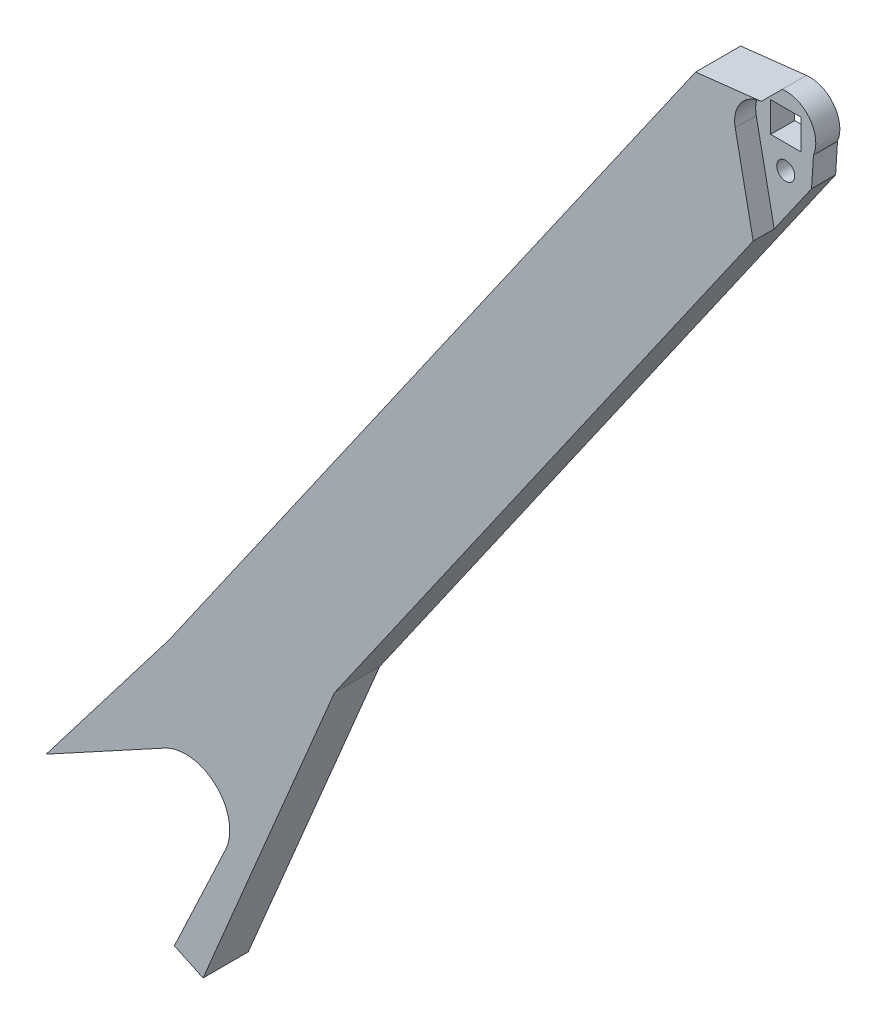
ISO-10303-21;
HEADER;
FILE_DESCRIPTION(('STEP AP214'),'2;1');
FILE_NAME('part.step','',(''),(''),'','','');
FILE_SCHEMA(('AUTOMOTIVE_DESIGN { 1 0 10303 214 1 1 1 1 }'));
ENDSEC;
DATA;
#1=APPLICATION_CONTEXT('core data for automotive mechanical design processes');
#2=APPLICATION_PROTOCOL_DEFINITION('international standard','automotive_design',2000,#1);
#3=PRODUCT_CONTEXT('',#1,'mechanical');
#4=PRODUCT('Part','Part','',(#3));
#5=PRODUCT_RELATED_PRODUCT_CATEGORY('part','',(#4));
#6=PRODUCT_DEFINITION_FORMATION('','',#4);
#7=PRODUCT_DEFINITION_CONTEXT('part definition',#1,'design');
#8=PRODUCT_DEFINITION('design','',#6,#7);
#9=PRODUCT_DEFINITION_SHAPE('','',#8);
#10=(LENGTH_UNIT() NAMED_UNIT(*) SI_UNIT(.MILLI.,.METRE.));
#11=(NAMED_UNIT(*) PLANE_ANGLE_UNIT() SI_UNIT($,.RADIAN.));
#12=(NAMED_UNIT(*) SI_UNIT($,.STERADIAN.) SOLID_ANGLE_UNIT());
#13=UNCERTAINTY_MEASURE_WITH_UNIT(LENGTH_MEASURE(1.E-05),#10,'distance_accuracy_value','');
#14=(GEOMETRIC_REPRESENTATION_CONTEXT(3) GLOBAL_UNCERTAINTY_ASSIGNED_CONTEXT((#13)) GLOBAL_UNIT_ASSIGNED_CONTEXT((#10,
#11,#12)) REPRESENTATION_CONTEXT('',''));
#15=CARTESIAN_POINT('',(0.,0.,0.));
#16=DIRECTION('',(0.,0.,1.));
#17=DIRECTION('',(1.,0.,0.));
#18=AXIS2_PLACEMENT_3D('',#15,#16,#17);
#19=CARTESIAN_POINT('',(157.605048009033,186.145582035712,9.525));
#20=DIRECTION('',(-0.998013276199365,0.0630039723335802,0.));
#21=DIRECTION('',(-0.0630039723335802,-0.998013276199365,0.));
#22=AXIS2_PLACEMENT_3D('',#19,#20,#21);
#23=PLANE('',#22);
#24=DIRECTION('',(0.0630039723335805,0.998013276199365,0.));
#25=VECTOR('',#24,1.);
#26=CARTESIAN_POINT('',(157.605048009033,186.145582035712,5.08));
#27=LINE('',#26,#25);
#28=CARTESIAN_POINT('',(157.204972784715,179.808197731846,5.08));
#29=VERTEX_POINT('',#28);
#30=CARTESIAN_POINT('',(157.605048009033,186.145582035712,5.08));
#31=VERTEX_POINT('',#30);
#32=EDGE_CURVE('E223',#29,#31,#27,.T.);
#33=ORIENTED_EDGE('',*,*,#32,.F.);
#34=DIRECTION('',(0.,0.,-1.));
#35=VECTOR('',#34,1.);
#36=CARTESIAN_POINT('',(157.204972784715,179.808197731846,9.525));
#37=LINE('',#36,#35);
#38=CARTESIAN_POINT('',(157.204972784715,179.808197731846,0.));
#39=VERTEX_POINT('',#38);
#40=EDGE_CURVE('E315',#29,#39,#37,.T.);
#41=ORIENTED_EDGE('',*,*,#40,.T.);
#42=DIRECTION('',(0.0630039723335802,0.998013276199365,0.));
#43=VECTOR('',#42,1.);
#44=CARTESIAN_POINT('',(157.605048009033,186.145582035712,0.));
#45=LINE('',#44,#43);
#46=CARTESIAN_POINT('',(157.605048009033,186.145582035712,0.));
#47=VERTEX_POINT('',#46);
#48=EDGE_CURVE('E269',#39,#47,#45,.T.);
#49=ORIENTED_EDGE('',*,*,#48,.T.);
#50=DIRECTION('',(0.,0.,-1.));
#51=VECTOR('',#50,1.);
#52=CARTESIAN_POINT('',(157.605048009033,186.145582035712,9.525));
#53=LINE('',#52,#51);
#54=EDGE_CURVE('E313',#31,#47,#53,.T.);
#55=ORIENTED_EDGE('',*,*,#54,.F.);
#56=EDGE_LOOP('',(#33,#41,#49,#55));
#57=FACE_BOUND('',#56,.T.);
#58=ADVANCED_FACE('F45',(#57),#23,.F.);
#59=CARTESIAN_POINT('',(151.750836383494,188.605400371159,9.525));
#60=DIRECTION('',(0.,0.,-1.));
#61=DIRECTION('',(-1.,0.,0.));
#62=AXIS2_PLACEMENT_3D('',#59,#60,#61);
#63=CYLINDRICAL_SURFACE('',#62,6.35);
#64=CARTESIAN_POINT('',(151.750836383494,188.605400371159,5.08));
#65=DIRECTION('',(0.,0.,1.));
#66=DIRECTION('',(1.,0.,0.));
#67=AXIS2_PLACEMENT_3D('',#64,#65,#66);
#68=CIRCLE('',#67,6.35);
#69=CARTESIAN_POINT('',(151.038083588784,194.915272275852,5.08));
#70=VERTEX_POINT('',#69);
#71=EDGE_CURVE('E214',#31,#70,#68,.T.);
#72=ORIENTED_EDGE('',*,*,#71,.F.);
#73=ORIENTED_EDGE('',*,*,#54,.T.);
#74=CARTESIAN_POINT('',(151.750836383494,188.605400371159,0.));
#75=DIRECTION('',(0.,0.,1.));
#76=DIRECTION('',(1.,0.,0.));
#77=AXIS2_PLACEMENT_3D('',#74,#75,#76);
#78=CIRCLE('',#77,6.35);
#79=CARTESIAN_POINT('',(151.038083588785,194.915272275852,0.));
#80=VERTEX_POINT('',#79);
#81=EDGE_CURVE('E272',#47,#80,#78,.T.);
#82=ORIENTED_EDGE('',*,*,#81,.T.);
#83=DIRECTION('',(0.,0.,-1.));
#84=VECTOR('',#83,1.);
#85=CARTESIAN_POINT('',(151.038083588785,194.915272275852,9.525));
#86=LINE('',#85,#84);
#87=EDGE_CURVE('E309',#70,#80,#86,.T.);
#88=ORIENTED_EDGE('',*,*,#87,.F.);
#89=EDGE_LOOP('',(#72,#73,#82,#88));
#90=FACE_BOUND('',#89,.T.);
#91=ADVANCED_FACE('F374',(#90),#63,.T.);
#92=CARTESIAN_POINT('',(33.1383425984574,-24.3669897778148,9.525));
#93=DIRECTION('',(0.425797036329878,0.904818702200995,0.));
#94=DIRECTION('',(-0.904818702200995,0.425797036329878,0.));
#95=AXIS2_PLACEMENT_3D('',#92,#93,#94);
#96=PLANE('',#95);
#97=DIRECTION('',(0.904818702200995,-0.425797036329878,0.));
#98=VECTOR('',#97,1.);
#99=CARTESIAN_POINT('',(33.1383425984574,-24.3669897778148,0.));
#100=LINE('',#99,#98);
#101=CARTESIAN_POINT('',(27.071909446706,-21.5121977064024,0.));
#102=VERTEX_POINT('',#101);
#103=CARTESIAN_POINT('',(33.1383425984574,-24.3669897778148,0.));
#104=VERTEX_POINT('',#103);
#105=EDGE_CURVE('E230',#102,#104,#100,.T.);
#106=ORIENTED_EDGE('',*,*,#105,.T.);
#107=DIRECTION('',(0.,0.,-1.));
#108=VECTOR('',#107,1.);
#109=CARTESIAN_POINT('',(33.1383425984574,-24.3669897778148,9.525));
#110=LINE('',#109,#108);
#111=CARTESIAN_POINT('',(33.1383425984574,-24.3669897778148,9.525));
#112=VERTEX_POINT('',#111);
#113=EDGE_CURVE('E53',#112,#104,#110,.T.);
#114=ORIENTED_EDGE('',*,*,#113,.F.);
#115=DIRECTION('',(0.904818702200995,-0.425797036329878,0.));
#116=VECTOR('',#115,1.);
#117=CARTESIAN_POINT('',(33.1383425984574,-24.3669897778148,9.525));
#118=LINE('',#117,#116);
#119=CARTESIAN_POINT('',(27.071909446706,-21.5121977064024,9.525));
#120=VERTEX_POINT('',#119);
#121=EDGE_CURVE('E233',#120,#112,#118,.T.);
#122=ORIENTED_EDGE('',*,*,#121,.F.);
#123=DIRECTION('',(0.,0.,-1.));
#124=VECTOR('',#123,1.);
#125=CARTESIAN_POINT('',(27.071909446706,-21.5121977064024,9.525));
#126=LINE('',#125,#124);
#127=EDGE_CURVE('E259',#120,#102,#126,.T.);
#128=ORIENTED_EDGE('',*,*,#127,.T.);
#129=EDGE_LOOP('',(#106,#114,#122,#128));
#130=FACE_BOUND('',#129,.T.);
#131=ADVANCED_FACE('F47',(#130),#96,.F.);
#132=CARTESIAN_POINT('',(60.9077714500657,41.7224896260158,9.525));
#133=DIRECTION('',(-0.921923090636116,0.387372966212087,0.));
#134=DIRECTION('',(-0.387372966212088,-0.921923090636117,0.));
#135=AXIS2_PLACEMENT_3D('',#132,#133,#134);
#136=PLANE('',#135);
#137=DIRECTION('',(0.387372966212087,0.921923090636116,0.));
#138=VECTOR('',#137,1.);
#139=CARTESIAN_POINT('',(60.9077714500657,41.7224896260158,0.));
#140=LINE('',#139,#138);
#141=CARTESIAN_POINT('',(60.9077714500657,41.7224896260158,0.));
#142=VERTEX_POINT('',#141);
#143=EDGE_CURVE('E262',#104,#142,#140,.T.);
#144=ORIENTED_EDGE('',*,*,#143,.T.);
#145=DIRECTION('',(0.,0.,-1.));
#146=VECTOR('',#145,1.);
#147=CARTESIAN_POINT('',(60.9077714500657,41.7224896260158,9.525));
#148=LINE('',#147,#146);
#149=CARTESIAN_POINT('',(60.9077714500657,41.7224896260158,9.525));
#150=VERTEX_POINT('',#149);
#151=EDGE_CURVE('E317',#150,#142,#148,.T.);
#152=ORIENTED_EDGE('',*,*,#151,.F.);
#153=DIRECTION('',(0.387372966212087,0.921923090636116,0.));
#154=VECTOR('',#153,1.);
#155=CARTESIAN_POINT('',(60.9077714500657,41.7224896260158,9.525));
#156=LINE('',#155,#154);
#157=EDGE_CURVE('E236',#112,#150,#156,.T.);
#158=ORIENTED_EDGE('',*,*,#157,.F.);
#159=ORIENTED_EDGE('',*,*,#113,.T.);
#160=EDGE_LOOP('',(#144,#152,#158,#159));
#161=FACE_BOUND('',#160,.T.);
#162=ADVANCED_FACE('F323',(#161),#136,.F.);
#163=CARTESIAN_POINT('',(157.204972784715,179.808197731846,9.525));
#164=DIRECTION('',(-0.820243076375479,0.572015118382452,0.));
#165=DIRECTION('',(-0.572015118382452,-0.820243076375479,0.));
#166=AXIS2_PLACEMENT_3D('',#163,#164,#165);
#167=PLANE('',#166);
#168=DIRECTION('',(0.572015118382449,0.820243076375481,0.));
#169=VECTOR('',#168,1.);
#170=CARTESIAN_POINT('',(157.204972784715,179.808197731846,5.08));
#171=LINE('',#170,#169);
#172=CARTESIAN_POINT('',(149.32084016817,168.502718236419,5.08));
#173=VERTEX_POINT('',#172);
#174=EDGE_CURVE('E221',#173,#29,#171,.T.);
#175=ORIENTED_EDGE('',*,*,#174,.F.);
#176=DIRECTION('',(0.,0.,1.));
#177=VECTOR('',#176,1.);
#178=CARTESIAN_POINT('',(149.32084016817,168.502718236419,5.08));
#179=LINE('',#178,#177);
#180=CARTESIAN_POINT('',(149.32084016817,168.502718236419,9.525));
#181=VERTEX_POINT('',#180);
#182=EDGE_CURVE('E227',#173,#181,#179,.T.);
#183=ORIENTED_EDGE('',*,*,#182,.T.);
#184=DIRECTION('',(0.572015118382452,0.820243076375479,0.));
#185=VECTOR('',#184,1.);
#186=CARTESIAN_POINT('',(157.204972784715,179.808197731846,9.525));
#187=LINE('',#186,#185);
#188=EDGE_CURVE('E240',#150,#181,#187,.T.);
#189=ORIENTED_EDGE('',*,*,#188,.F.);
#190=ORIENTED_EDGE('',*,*,#151,.T.);
#191=DIRECTION('',(0.572015118382452,0.820243076375479,0.));
#192=VECTOR('',#191,1.);
#193=CARTESIAN_POINT('',(157.204972784715,179.808197731846,0.));
#194=LINE('',#193,#192);
#195=EDGE_CURVE('E265',#142,#39,#194,.T.);
#196=ORIENTED_EDGE('',*,*,#195,.T.);
#197=ORIENTED_EDGE('',*,*,#40,.F.);
#198=EDGE_LOOP('',(#175,#183,#189,#190,#196,#197));
#199=FACE_BOUND('',#198,.T.);
#200=ADVANCED_FACE('F338',(#199),#167,.F.);
#201=CARTESIAN_POINT('',(151.038083588785,194.915272275852,9.525));
#202=DIRECTION('',(0.112244534599888,-0.993680614912284,0.));
#203=DIRECTION('',(0.993680614912284,0.112244534599888,0.));
#204=AXIS2_PLACEMENT_3D('',#201,#202,#203);
#205=PLANE('',#204);
#206=DIRECTION('',(-0.993680614912284,-0.112244534599888,0.));
#207=VECTOR('',#206,1.);
#208=CARTESIAN_POINT('',(151.038083588785,194.915272275852,0.));
#209=LINE('',#208,#207);
#210=CARTESIAN_POINT('',(137.15636539846,193.347216127492,0.));
#211=VERTEX_POINT('',#210);
#212=EDGE_CURVE('E275',#80,#211,#209,.T.);
#213=ORIENTED_EDGE('',*,*,#212,.T.);
#214=DIRECTION('',(0.,0.,-1.));
#215=VECTOR('',#214,1.);
#216=CARTESIAN_POINT('',(137.15636539846,193.347216127492,9.525));
#217=LINE('',#216,#215);
#218=CARTESIAN_POINT('',(137.15636539846,193.347216127492,9.525));
#219=VERTEX_POINT('',#218);
#220=EDGE_CURVE('E306',#219,#211,#217,.T.);
#221=ORIENTED_EDGE('',*,*,#220,.F.);
#222=DIRECTION('',(-0.993680614912284,-0.112244534599888,0.));
#223=VECTOR('',#222,1.);
#224=CARTESIAN_POINT('',(151.038083588785,194.915272275852,9.525));
#225=LINE('',#224,#223);
#226=CARTESIAN_POINT('',(151.038083588785,194.915272275852,9.525));
#227=VERTEX_POINT('',#226);
#228=EDGE_CURVE('E244',#227,#219,#225,.T.);
#229=ORIENTED_EDGE('',*,*,#228,.F.);
#230=EDGE_CURVE('E310',#227,#70,#86,.T.);
#231=ORIENTED_EDGE('',*,*,#230,.T.);
#232=ORIENTED_EDGE('',*,*,#87,.T.);
#233=EDGE_LOOP('',(#213,#221,#229,#231,#232));
#234=FACE_BOUND('',#233,.T.);
#235=ADVANCED_FACE('F369',(#234),#205,.F.);
#236=CARTESIAN_POINT('',(25.8991366809734,33.8095245183934,9.525));
#237=DIRECTION('',(0.820243076375479,-0.572015118382452,0.));
#238=DIRECTION('',(0.572015118382452,0.820243076375479,0.));
#239=AXIS2_PLACEMENT_3D('',#236,#237,#238);
#240=PLANE('',#239);
#241=DIRECTION('',(-0.572015118382452,-0.820243076375479,0.));
#242=VECTOR('',#241,1.);
#243=CARTESIAN_POINT('',(25.8991366809734,33.8095245183934,0.));
#244=LINE('',#243,#242);
#245=CARTESIAN_POINT('',(25.8991366809734,33.8095245183934,0.));
#246=VERTEX_POINT('',#245);
#247=EDGE_CURVE('E277',#211,#246,#244,.T.);
#248=ORIENTED_EDGE('',*,*,#247,.T.);
#249=DIRECTION('',(0.,0.,-1.));
#250=VECTOR('',#249,1.);
#251=CARTESIAN_POINT('',(25.8991366809734,33.8095245183934,9.525));
#252=LINE('',#251,#250);
#253=CARTESIAN_POINT('',(25.8991366809734,33.8095245183934,9.525));
#254=VERTEX_POINT('',#253);
#255=EDGE_CURVE('E302',#254,#246,#252,.T.);
#256=ORIENTED_EDGE('',*,*,#255,.F.);
#257=DIRECTION('',(-0.572015118382452,-0.820243076375479,0.));
#258=VECTOR('',#257,1.);
#259=CARTESIAN_POINT('',(25.8991366809734,33.8095245183934,9.525));
#260=LINE('',#259,#258);
#261=EDGE_CURVE('E246',#219,#254,#260,.T.);
#262=ORIENTED_EDGE('',*,*,#261,.F.);
#263=ORIENTED_EDGE('',*,*,#220,.T.);
#264=EDGE_LOOP('',(#248,#256,#262,#263));
#265=FACE_BOUND('',#264,.T.);
#266=ADVANCED_FACE('F365',(#265),#240,.F.);
#267=CARTESIAN_POINT('',(0.,0.,9.525));
#268=DIRECTION('',(0.793850039485968,-0.608113570649535,0.));
#269=DIRECTION('',(0.608113570649535,0.793850039485968,0.));
#270=AXIS2_PLACEMENT_3D('',#267,#268,#269);
#271=PLANE('',#270);
#272=DIRECTION('',(-0.608113570649535,-0.793850039485968,0.));
#273=VECTOR('',#272,1.);
#274=CARTESIAN_POINT('',(0.,0.,0.));
#275=LINE('',#274,#273);
#276=CARTESIAN_POINT('',(0.,0.,0.));
#277=VERTEX_POINT('',#276);
#278=EDGE_CURVE('E280',#246,#277,#275,.T.);
#279=ORIENTED_EDGE('',*,*,#278,.T.);
#280=DIRECTION('',(0.,0.,-1.));
#281=VECTOR('',#280,1.);
#282=CARTESIAN_POINT('',(0.,0.,9.525));
#283=LINE('',#282,#281);
#284=CARTESIAN_POINT('',(0.,0.,9.525));
#285=VERTEX_POINT('',#284);
#286=EDGE_CURVE('E299',#285,#277,#283,.T.);
#287=ORIENTED_EDGE('',*,*,#286,.F.);
#288=DIRECTION('',(-0.608113570649535,-0.793850039485968,0.));
#289=VECTOR('',#288,1.);
#290=CARTESIAN_POINT('',(0.,0.,9.525));
#291=LINE('',#290,#289);
#292=EDGE_CURVE('E249',#254,#285,#291,.T.);
#293=ORIENTED_EDGE('',*,*,#292,.F.);
#294=ORIENTED_EDGE('',*,*,#255,.T.);
#295=EDGE_LOOP('',(#279,#287,#293,#294));
#296=FACE_BOUND('',#295,.T.);
#297=ADVANCED_FACE('F361',(#296),#271,.F.);
#298=CARTESIAN_POINT('',(0.,0.,9.525));
#299=DIRECTION('',(-0.478273982851326,0.878210679351788,0.));
#300=DIRECTION('',(-0.878210679351788,-0.478273982851326,0.));
#301=AXIS2_PLACEMENT_3D('',#298,#299,#300);
#302=PLANE('',#301);
#303=DIRECTION('',(0.878210679351788,0.478273982851326,0.));
#304=VECTOR('',#303,1.);
#305=CARTESIAN_POINT('',(0.,0.,0.));
#306=LINE('',#305,#304);
#307=CARTESIAN_POINT('',(25.0036666300704,13.617009569819,0.));
#308=VERTEX_POINT('',#307);
#309=EDGE_CURVE('E283',#277,#308,#306,.T.);
#310=ORIENTED_EDGE('',*,*,#309,.T.);
#311=DIRECTION('',(0.,0.,-1.));
#312=VECTOR('',#311,1.);
#313=CARTESIAN_POINT('',(25.0036666300704,13.617009569819,9.525));
#314=LINE('',#313,#312);
#315=CARTESIAN_POINT('',(25.0036666300704,13.617009569819,9.525));
#316=VERTEX_POINT('',#315);
#317=EDGE_CURVE('E296',#316,#308,#314,.T.);
#318=ORIENTED_EDGE('',*,*,#317,.F.);
#319=DIRECTION('',(0.878210679351788,0.478273982851326,0.));
#320=VECTOR('',#319,1.);
#321=CARTESIAN_POINT('',(0.,0.,9.525));
#322=LINE('',#321,#320);
#323=EDGE_CURVE('E252',#285,#316,#322,.T.);
#324=ORIENTED_EDGE('',*,*,#323,.F.);
#325=ORIENTED_EDGE('',*,*,#286,.T.);
#326=EDGE_LOOP('',(#310,#318,#324,#325));
#327=FACE_BOUND('',#326,.T.);
#328=ADVANCED_FACE('F356',(#327),#302,.F.);
#329=CARTESIAN_POINT('',(29.4587815801275,5.43649031272988,9.525));
#330=DIRECTION('',(0.,0.,-1.));
#331=DIRECTION('',(-1.,0.,0.));
#332=AXIS2_PLACEMENT_3D('',#329,#330,#331);
#333=CYLINDRICAL_SURFACE('',#332,9.31498494544292);
#334=CARTESIAN_POINT('',(29.4587815801275,5.43649031272988,0.));
#335=DIRECTION('',(0.,0.,-1.));
#336=DIRECTION('',(1.,0.,0.));
#337=AXIS2_PLACEMENT_3D('',#334,#335,#336);
#338=CIRCLE('',#337,9.31498494544292);
#339=CARTESIAN_POINT('',(37.8871541694849,1.47019732950286,0.));
#340=VERTEX_POINT('',#339);
#341=EDGE_CURVE('E285',#308,#340,#338,.T.);
#342=ORIENTED_EDGE('',*,*,#341,.T.);
#343=DIRECTION('',(0.,0.,-1.));
#344=VECTOR('',#343,1.);
#345=CARTESIAN_POINT('',(37.8871541694849,1.47019732950286,9.525));
#346=LINE('',#345,#344);
#347=CARTESIAN_POINT('',(37.8871541694849,1.47019732950286,9.525));
#348=VERTEX_POINT('',#347);
#349=EDGE_CURVE('E292',#348,#340,#346,.T.);
#350=ORIENTED_EDGE('',*,*,#349,.F.);
#351=CARTESIAN_POINT('',(29.4587815801275,5.43649031272988,9.525));
#352=DIRECTION('',(0.,0.,-1.));
#353=DIRECTION('',(1.,0.,0.));
#354=AXIS2_PLACEMENT_3D('',#351,#352,#353);
#355=CIRCLE('',#354,9.31498494544292);
#356=EDGE_CURVE('E254',#316,#348,#355,.T.);
#357=ORIENTED_EDGE('',*,*,#356,.F.);
#358=ORIENTED_EDGE('',*,*,#317,.T.);
#359=EDGE_LOOP('',(#342,#350,#357,#358));
#360=FACE_BOUND('',#359,.T.);
#361=ADVANCED_FACE('F350',(#360),#333,.F.);
#362=CARTESIAN_POINT('',(37.8871541694849,1.47019732950286,9.525));
#363=DIRECTION('',(0.904818702200995,-0.425797036329878,0.));
#364=DIRECTION('',(0.425797036329878,0.904818702200995,0.));
#365=AXIS2_PLACEMENT_3D('',#362,#363,#364);
#366=PLANE('',#365);
#367=DIRECTION('',(-0.425797036329878,-0.904818702200995,0.));
#368=VECTOR('',#367,1.);
#369=CARTESIAN_POINT('',(37.8871541694849,1.47019732950286,0.));
#370=LINE('',#369,#368);
#371=EDGE_CURVE('E237',#340,#102,#370,.T.);
#372=ORIENTED_EDGE('',*,*,#371,.T.);
#373=ORIENTED_EDGE('',*,*,#127,.F.);
#374=DIRECTION('',(-0.425797036329878,-0.904818702200995,0.));
#375=VECTOR('',#374,1.);
#376=CARTESIAN_POINT('',(37.8871541694849,1.47019732950286,9.525));
#377=LINE('',#376,#375);
#378=EDGE_CURVE('E257',#348,#120,#377,.T.);
#379=ORIENTED_EDGE('',*,*,#378,.F.);
#380=ORIENTED_EDGE('',*,*,#349,.T.);
#381=EDGE_LOOP('',(#372,#373,#379,#380));
#382=FACE_BOUND('',#381,.T.);
#383=ADVANCED_FACE('F348',(#382),#366,.F.);
#384=CARTESIAN_POINT('',(29.4587815801275,5.43649031272988,9.525));
#385=DIRECTION('',(0.,0.,1.));
#386=DIRECTION('',(1.,0.,0.));
#387=AXIS2_PLACEMENT_3D('',#384,#385,#386);
#388=PLANE('',#387);
#389=DIRECTION('',(0.197377020703433,-0.980327655275641,0.));
#390=VECTOR('',#389,1.);
#391=CARTESIAN_POINT('',(149.32084016817,168.502718236419,9.525));
#392=LINE('',#391,#390);
#393=CARTESIAN_POINT('',(145.525755772493,187.352056289692,9.525));
#394=VERTEX_POINT('',#393);
#395=EDGE_CURVE('E205',#394,#181,#392,.T.);
#396=ORIENTED_EDGE('',*,*,#395,.F.);
#397=CARTESIAN_POINT('',(151.750836383494,188.605400371159,9.525));
#398=DIRECTION('',(0.,0.,1.));
#399=DIRECTION('',(1.,0.,0.));
#400=AXIS2_PLACEMENT_3D('',#397,#398,#399);
#401=CIRCLE('',#400,6.35000000000001);
#402=EDGE_CURVE('E11',#227,#394,#401,.T.);
#403=ORIENTED_EDGE('',*,*,#402,.F.);
#404=ORIENTED_EDGE('',*,*,#228,.T.);
#405=ORIENTED_EDGE('',*,*,#261,.T.);
#406=ORIENTED_EDGE('',*,*,#292,.T.);
#407=ORIENTED_EDGE('',*,*,#323,.T.);
#408=ORIENTED_EDGE('',*,*,#356,.T.);
#409=ORIENTED_EDGE('',*,*,#378,.T.);
#410=ORIENTED_EDGE('',*,*,#121,.T.);
#411=ORIENTED_EDGE('',*,*,#157,.T.);
#412=ORIENTED_EDGE('',*,*,#188,.T.);
#413=EDGE_LOOP('',(#396,#403,#404,#405,#406,#407,#408,#409,#410,#411,#412));
#414=FACE_BOUND('',#413,.T.);
#415=ADVANCED_FACE('F342',(#414),#388,.T.);
#416=CARTESIAN_POINT('',(29.4587815801275,5.43649031272988,0.));
#417=DIRECTION('',(0.,0.,1.));
#418=DIRECTION('',(1.,0.,0.));
#419=AXIS2_PLACEMENT_3D('',#416,#417,#418);
#420=PLANE('',#419);
#421=DIRECTION('',(1.,0.,0.));
#422=VECTOR('',#421,1.);
#423=CARTESIAN_POINT('',(154.925836383493,185.430400371159,0.));
#424=LINE('',#423,#422);
#425=CARTESIAN_POINT('',(148.575836383493,185.430400371159,0.));
#426=VERTEX_POINT('',#425);
#427=CARTESIAN_POINT('',(154.925836383493,185.430400371159,0.));
#428=VERTEX_POINT('',#427);
#429=EDGE_CURVE('E179',#426,#428,#424,.T.);
#430=ORIENTED_EDGE('',*,*,#429,.T.);
#431=DIRECTION('',(0.,1.,0.));
#432=VECTOR('',#431,1.);
#433=CARTESIAN_POINT('',(154.925836383493,191.780400371159,0.));
#434=LINE('',#433,#432);
#435=CARTESIAN_POINT('',(154.925836383493,191.780400371159,0.));
#436=VERTEX_POINT('',#435);
#437=EDGE_CURVE('E173',#428,#436,#434,.T.);
#438=ORIENTED_EDGE('',*,*,#437,.T.);
#439=DIRECTION('',(-1.,0.,0.));
#440=VECTOR('',#439,1.);
#441=CARTESIAN_POINT('',(148.575836383493,191.780400371159,0.));
#442=LINE('',#441,#440);
#443=CARTESIAN_POINT('',(148.575836383493,191.780400371159,0.));
#444=VERTEX_POINT('',#443);
#445=EDGE_CURVE('E182',#436,#444,#442,.T.);
#446=ORIENTED_EDGE('',*,*,#445,.T.);
#447=DIRECTION('',(0.,-1.,0.));
#448=VECTOR('',#447,1.);
#449=CARTESIAN_POINT('',(148.575836383493,185.430400371159,0.));
#450=LINE('',#449,#448);
#451=EDGE_CURVE('E60',#444,#426,#450,.T.);
#452=ORIENTED_EDGE('',*,*,#451,.T.);
#453=EDGE_LOOP('',(#430,#438,#446,#452));
#454=FACE_BOUND('',#453,.T.);
#455=CARTESIAN_POINT('',(151.750836383494,180.350400371159,0.));
#456=DIRECTION('',(0.,0.,1.));
#457=DIRECTION('',(1.,0.,0.));
#458=AXIS2_PLACEMENT_3D('',#455,#456,#457);
#459=CIRCLE('',#458,1.90499999999953);
#460=CARTESIAN_POINT('',(153.655836383494,180.350400371159,0.));
#461=VERTEX_POINT('',#460);
#462=EDGE_CURVE('E211',#461,#461,#459,.T.);
#463=ORIENTED_EDGE('',*,*,#462,.T.);
#464=EDGE_LOOP('',(#463));
#465=FACE_BOUND('',#464,.T.);
#466=ORIENTED_EDGE('',*,*,#105,.F.);
#467=ORIENTED_EDGE('',*,*,#371,.F.);
#468=ORIENTED_EDGE('',*,*,#341,.F.);
#469=ORIENTED_EDGE('',*,*,#309,.F.);
#470=ORIENTED_EDGE('',*,*,#278,.F.);
#471=ORIENTED_EDGE('',*,*,#247,.F.);
#472=ORIENTED_EDGE('',*,*,#212,.F.);
#473=ORIENTED_EDGE('',*,*,#81,.F.);
#474=ORIENTED_EDGE('',*,*,#48,.F.);
#475=ORIENTED_EDGE('',*,*,#195,.F.);
#476=ORIENTED_EDGE('',*,*,#143,.F.);
#477=EDGE_LOOP('',(#466,#467,#468,#469,#470,#471,#472,#473,#474,#475,#476));
#478=FACE_BOUND('',#477,.T.);
#479=ADVANCED_FACE('F186',(#454,#465,#478),#420,.F.);
#480=CARTESIAN_POINT('',(149.32084016817,168.502718236419,5.08));
#481=DIRECTION('',(-0.980327655275641,-0.197377020703433,0.));
#482=DIRECTION('',(0.197377020703433,-0.980327655275641,0.));
#483=AXIS2_PLACEMENT_3D('',#480,#481,#482);
#484=PLANE('',#483);
#485=ORIENTED_EDGE('',*,*,#395,.T.);
#486=ORIENTED_EDGE('',*,*,#182,.F.);
#487=DIRECTION('',(0.197377020703433,-0.980327655275641,0.));
#488=VECTOR('',#487,1.);
#489=CARTESIAN_POINT('',(149.32084016817,168.502718236419,5.08));
#490=LINE('',#489,#488);
#491=CARTESIAN_POINT('',(145.525755772493,187.352056289692,5.08));
#492=VERTEX_POINT('',#491);
#493=EDGE_CURVE('E217',#492,#173,#490,.T.);
#494=ORIENTED_EDGE('',*,*,#493,.F.);
#495=DIRECTION('',(0.,0.,1.));
#496=VECTOR('',#495,1.);
#497=CARTESIAN_POINT('',(145.525755772493,187.352056289692,5.08));
#498=LINE('',#497,#496);
#499=EDGE_CURVE('E225',#492,#394,#498,.T.);
#500=ORIENTED_EDGE('',*,*,#499,.T.);
#501=EDGE_LOOP('',(#485,#486,#494,#500));
#502=FACE_BOUND('',#501,.T.);
#503=ADVANCED_FACE('F383',(#502),#484,.F.);
#504=CARTESIAN_POINT('',(151.750836383494,188.605400371159,5.08));
#505=DIRECTION('',(0.,0.,1.));
#506=DIRECTION('',(1.,0.,0.));
#507=AXIS2_PLACEMENT_3D('',#504,#505,#506);
#508=CYLINDRICAL_SURFACE('',#507,6.35000000000001);
#509=ORIENTED_EDGE('',*,*,#230,.F.);
#510=ORIENTED_EDGE('',*,*,#402,.T.);
#511=ORIENTED_EDGE('',*,*,#499,.F.);
#512=EDGE_CURVE('E218',#70,#492,#68,.T.);
#513=ORIENTED_EDGE('',*,*,#512,.F.);
#514=EDGE_LOOP('',(#509,#510,#511,#513));
#515=FACE_BOUND('',#514,.T.);
#516=ADVANCED_FACE('F385',(#515),#508,.F.);
#517=CARTESIAN_POINT('',(151.750836383494,188.605400371159,5.08));
#518=DIRECTION('',(0.,0.,1.));
#519=DIRECTION('',(1.,0.,0.));
#520=AXIS2_PLACEMENT_3D('',#517,#518,#519);
#521=PLANE('',#520);
#522=DIRECTION('',(0.,1.,0.));
#523=VECTOR('',#522,1.);
#524=CARTESIAN_POINT('',(154.925836383493,191.780400371159,5.08));
#525=LINE('',#524,#523);
#526=CARTESIAN_POINT('',(154.925836383493,185.430400371159,5.08));
#527=VERTEX_POINT('',#526);
#528=CARTESIAN_POINT('',(154.925836383493,191.780400371159,5.08));
#529=VERTEX_POINT('',#528);
#530=EDGE_CURVE('E68',#527,#529,#525,.T.);
#531=ORIENTED_EDGE('',*,*,#530,.F.);
#532=DIRECTION('',(1.,0.,0.));
#533=VECTOR('',#532,1.);
#534=CARTESIAN_POINT('',(154.925836383493,185.430400371159,5.08));
#535=LINE('',#534,#533);
#536=CARTESIAN_POINT('',(148.575836383493,185.430400371159,5.08));
#537=VERTEX_POINT('',#536);
#538=EDGE_CURVE('E189',#537,#527,#535,.T.);
#539=ORIENTED_EDGE('',*,*,#538,.F.);
#540=DIRECTION('',(0.,-1.,0.));
#541=VECTOR('',#540,1.);
#542=CARTESIAN_POINT('',(148.575836383493,185.430400371159,5.08));
#543=LINE('',#542,#541);
#544=CARTESIAN_POINT('',(148.575836383493,191.780400371159,5.08));
#545=VERTEX_POINT('',#544);
#546=EDGE_CURVE('E192',#545,#537,#543,.T.);
#547=ORIENTED_EDGE('',*,*,#546,.F.);
#548=DIRECTION('',(-1.,0.,0.));
#549=VECTOR('',#548,1.);
#550=CARTESIAN_POINT('',(148.575836383493,191.780400371159,5.08));
#551=LINE('',#550,#549);
#552=EDGE_CURVE('E198',#529,#545,#551,.T.);
#553=ORIENTED_EDGE('',*,*,#552,.F.);
#554=EDGE_LOOP('',(#531,#539,#547,#553));
#555=FACE_BOUND('',#554,.T.);
#556=CARTESIAN_POINT('',(151.750836383494,180.350400371159,5.08));
#557=DIRECTION('',(0.,0.,1.));
#558=DIRECTION('',(1.,0.,0.));
#559=AXIS2_PLACEMENT_3D('',#556,#557,#558);
#560=CIRCLE('',#559,1.90499999999953);
#561=CARTESIAN_POINT('',(153.655836383494,180.350400371159,5.08));
#562=VERTEX_POINT('',#561);
#563=EDGE_CURVE('E199',#562,#562,#560,.T.);
#564=ORIENTED_EDGE('',*,*,#563,.F.);
#565=EDGE_LOOP('',(#564));
#566=FACE_BOUND('',#565,.T.);
#567=ORIENTED_EDGE('',*,*,#71,.T.);
#568=ORIENTED_EDGE('',*,*,#512,.T.);
#569=ORIENTED_EDGE('',*,*,#493,.T.);
#570=ORIENTED_EDGE('',*,*,#174,.T.);
#571=ORIENTED_EDGE('',*,*,#32,.T.);
#572=EDGE_LOOP('',(#567,#568,#569,#570,#571));
#573=FACE_BOUND('',#572,.T.);
#574=ADVANCED_FACE('F379',(#555,#566,#573),#521,.T.);
#575=CARTESIAN_POINT('',(151.750836383494,180.350400371159,0.));
#576=DIRECTION('',(0.,0.,1.));
#577=DIRECTION('',(1.,0.,0.));
#578=AXIS2_PLACEMENT_3D('',#575,#576,#577);
#579=CYLINDRICAL_SURFACE('',#578,1.90499999999953);
#580=ORIENTED_EDGE('',*,*,#462,.F.);
#581=EDGE_LOOP('',(#580));
#582=FACE_BOUND('',#581,.T.);
#583=ORIENTED_EDGE('',*,*,#563,.T.);
#584=EDGE_LOOP('',(#583));
#585=FACE_BOUND('',#584,.T.);
#586=ADVANCED_FACE('F393',(#582,#585),#579,.F.);
#587=CARTESIAN_POINT('',(154.925836383493,191.780400371159,0.));
#588=DIRECTION('',(1.,0.,0.));
#589=DIRECTION('',(0.,1.,0.));
#590=AXIS2_PLACEMENT_3D('',#587,#588,#589);
#591=PLANE('',#590);
#592=ORIENTED_EDGE('',*,*,#530,.T.);
#593=DIRECTION('',(0.,0.,1.));
#594=VECTOR('',#593,1.);
#595=CARTESIAN_POINT('',(154.925836383493,191.780400371159,0.));
#596=LINE('',#595,#594);
#597=EDGE_CURVE('E169',#436,#529,#596,.T.);
#598=ORIENTED_EDGE('',*,*,#597,.F.);
#599=ORIENTED_EDGE('',*,*,#437,.F.);
#600=DIRECTION('',(0.,0.,1.));
#601=VECTOR('',#600,1.);
#602=CARTESIAN_POINT('',(154.925836383493,185.430400371159,0.));
#603=LINE('',#602,#601);
#604=EDGE_CURVE('E203',#428,#527,#603,.T.);
#605=ORIENTED_EDGE('',*,*,#604,.T.);
#606=EDGE_LOOP('',(#592,#598,#599,#605));
#607=FACE_BOUND('',#606,.T.);
#608=ADVANCED_FACE('F171',(#607),#591,.F.);
#609=CARTESIAN_POINT('',(154.925836383493,185.430400371159,0.));
#610=DIRECTION('',(0.,-1.,0.));
#611=DIRECTION('',(1.,0.,0.));
#612=AXIS2_PLACEMENT_3D('',#609,#610,#611);
#613=PLANE('',#612);
#614=ORIENTED_EDGE('',*,*,#538,.T.);
#615=ORIENTED_EDGE('',*,*,#604,.F.);
#616=ORIENTED_EDGE('',*,*,#429,.F.);
#617=DIRECTION('',(0.,0.,1.));
#618=VECTOR('',#617,1.);
#619=CARTESIAN_POINT('',(148.575836383493,185.430400371159,0.));
#620=LINE('',#619,#618);
#621=EDGE_CURVE('E206',#426,#537,#620,.T.);
#622=ORIENTED_EDGE('',*,*,#621,.T.);
#623=EDGE_LOOP('',(#614,#615,#616,#622));
#624=FACE_BOUND('',#623,.T.);
#625=ADVANCED_FACE('F519',(#624),#613,.F.);
#626=CARTESIAN_POINT('',(148.575836383493,185.430400371159,0.));
#627=DIRECTION('',(-1.,0.,0.));
#628=DIRECTION('',(0.,-1.,0.));
#629=AXIS2_PLACEMENT_3D('',#626,#627,#628);
#630=PLANE('',#629);
#631=ORIENTED_EDGE('',*,*,#546,.T.);
#632=ORIENTED_EDGE('',*,*,#621,.F.);
#633=ORIENTED_EDGE('',*,*,#451,.F.);
#634=DIRECTION('',(0.,0.,1.));
#635=VECTOR('',#634,1.);
#636=CARTESIAN_POINT('',(148.575836383493,191.780400371159,0.));
#637=LINE('',#636,#635);
#638=EDGE_CURVE('E178',#444,#545,#637,.T.);
#639=ORIENTED_EDGE('',*,*,#638,.T.);
#640=EDGE_LOOP('',(#631,#632,#633,#639));
#641=FACE_BOUND('',#640,.T.);
#642=ADVANCED_FACE('F528',(#641),#630,.F.);
#643=CARTESIAN_POINT('',(148.575836383493,191.780400371159,0.));
#644=DIRECTION('',(0.,1.,0.));
#645=DIRECTION('',(0.,0.,1.));
#646=AXIS2_PLACEMENT_3D('',#643,#644,#645);
#647=PLANE('',#646);
#648=ORIENTED_EDGE('',*,*,#552,.T.);
#649=ORIENTED_EDGE('',*,*,#638,.F.);
#650=ORIENTED_EDGE('',*,*,#445,.F.);
#651=ORIENTED_EDGE('',*,*,#597,.T.);
#652=EDGE_LOOP('',(#648,#649,#650,#651));
#653=FACE_BOUND('',#652,.T.);
#654=ADVANCED_FACE('F183',(#653),#647,.F.);
#655=CLOSED_SHELL('',(#58,#91,#131,#162,#200,#235,#266,#297,#328,#361,#383,#415,#479,#503,#516,
#574,#586,#608,#625,#642,#654));
#656=MANIFOLD_SOLID_BREP('B2',#655);
#657=ADVANCED_BREP_SHAPE_REPRESENTATION('',(#18,#656),#14);
#658=SHAPE_DEFINITION_REPRESENTATION(#9,#657);
ENDSEC;
END-ISO-10303-21;
